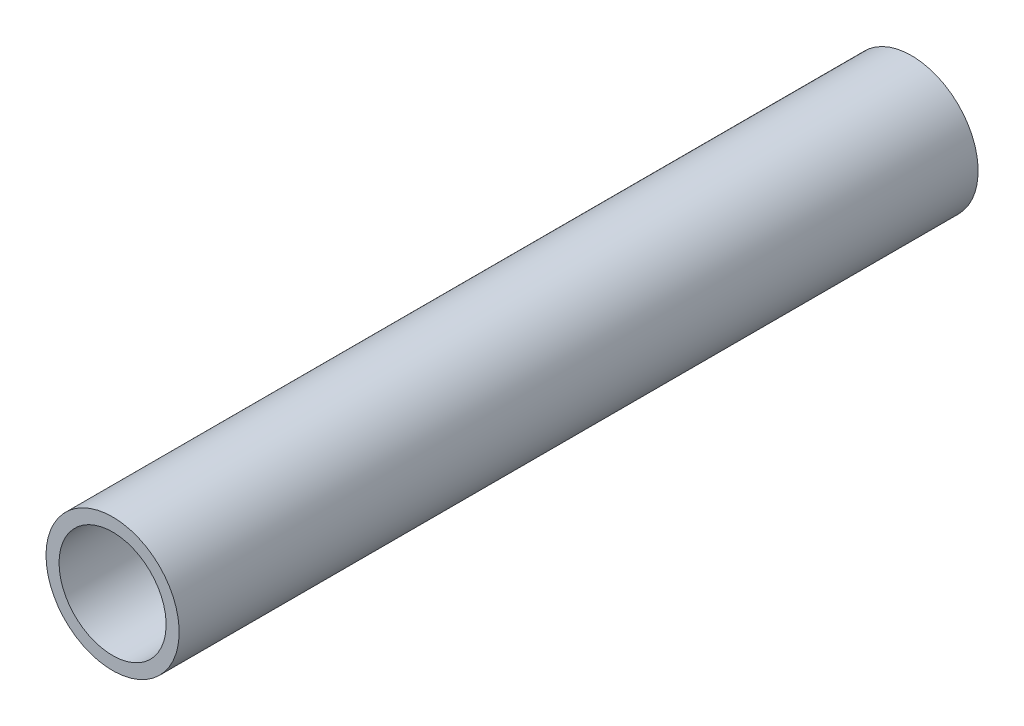
ISO-10303-21;
HEADER;
FILE_DESCRIPTION(('STEP AP214'),'2;1');
FILE_NAME('part.step','',(''),(''),'','','');
FILE_SCHEMA(('AUTOMOTIVE_DESIGN { 1 0 10303 214 1 1 1 1 }'));
ENDSEC;
DATA;
#1=APPLICATION_CONTEXT('core data for automotive mechanical design processes');
#2=APPLICATION_PROTOCOL_DEFINITION('international standard','automotive_design',2000,#1);
#3=PRODUCT_CONTEXT('',#1,'mechanical');
#4=PRODUCT('Part','Part','',(#3));
#5=PRODUCT_RELATED_PRODUCT_CATEGORY('part','',(#4));
#6=PRODUCT_DEFINITION_FORMATION('','',#4);
#7=PRODUCT_DEFINITION_CONTEXT('part definition',#1,'design');
#8=PRODUCT_DEFINITION('design','',#6,#7);
#9=PRODUCT_DEFINITION_SHAPE('','',#8);
#10=(LENGTH_UNIT() NAMED_UNIT(*) SI_UNIT(.MILLI.,.METRE.));
#11=(NAMED_UNIT(*) PLANE_ANGLE_UNIT() SI_UNIT($,.RADIAN.));
#12=(NAMED_UNIT(*) SI_UNIT($,.STERADIAN.) SOLID_ANGLE_UNIT());
#13=UNCERTAINTY_MEASURE_WITH_UNIT(LENGTH_MEASURE(1.E-05),#10,'distance_accuracy_value','');
#14=(GEOMETRIC_REPRESENTATION_CONTEXT(3) GLOBAL_UNCERTAINTY_ASSIGNED_CONTEXT((#13)) GLOBAL_UNIT_ASSIGNED_CONTEXT((#10,
#11,#12)) REPRESENTATION_CONTEXT('',''));
#15=CARTESIAN_POINT('',(0.,0.,0.));
#16=DIRECTION('',(0.,0.,1.));
#17=DIRECTION('',(1.,0.,0.));
#18=AXIS2_PLACEMENT_3D('',#15,#16,#17);
#19=CARTESIAN_POINT('',(0.,0.,-76.2));
#20=DIRECTION('',(0.,0.,-1.));
#21=DIRECTION('',(1.,0.,0.));
#22=AXIS2_PLACEMENT_3D('',#19,#20,#21);
#23=PLANE('',#22);
#24=CARTESIAN_POINT('',(0.,0.,-76.2));
#25=DIRECTION('',(0.,0.,1.));
#26=DIRECTION('',(1.,0.,0.));
#27=AXIS2_PLACEMENT_3D('',#24,#25,#26);
#28=CIRCLE('',#27,6.35);
#29=CARTESIAN_POINT('',(-6.35,0.,-76.2));
#30=VERTEX_POINT('',#29);
#31=EDGE_CURVE('E10',#30,#30,#28,.T.);
#32=ORIENTED_EDGE('',*,*,#31,.F.);
#33=EDGE_LOOP('',(#32));
#34=FACE_BOUND('',#33,.T.);
#35=CARTESIAN_POINT('',(0.,0.,-76.2));
#36=DIRECTION('',(0.,0.,1.));
#37=DIRECTION('',(1.,0.,0.));
#38=AXIS2_PLACEMENT_3D('',#35,#36,#37);
#39=CIRCLE('',#38,5.1054);
#40=CARTESIAN_POINT('',(-5.1054,0.,-76.2));
#41=VERTEX_POINT('',#40);
#42=EDGE_CURVE('E52',#41,#41,#39,.T.);
#43=ORIENTED_EDGE('',*,*,#42,.T.);
#44=EDGE_LOOP('',(#43));
#45=FACE_BOUND('',#44,.T.);
#46=ADVANCED_FACE('F41',(#34,#45),#23,.T.);
#47=CARTESIAN_POINT('',(0.,0.,0.));
#48=DIRECTION('',(0.,0.,-1.));
#49=DIRECTION('',(1.,0.,0.));
#50=AXIS2_PLACEMENT_3D('',#47,#48,#49);
#51=PLANE('',#50);
#52=CARTESIAN_POINT('',(0.,0.,0.));
#53=DIRECTION('',(0.,0.,1.));
#54=DIRECTION('',(1.,0.,0.));
#55=AXIS2_PLACEMENT_3D('',#52,#53,#54);
#56=CIRCLE('',#55,6.35);
#57=CARTESIAN_POINT('',(-6.35,0.,0.));
#58=VERTEX_POINT('',#57);
#59=EDGE_CURVE('E45',#58,#58,#56,.T.);
#60=ORIENTED_EDGE('',*,*,#59,.T.);
#61=EDGE_LOOP('',(#60));
#62=FACE_BOUND('',#61,.T.);
#63=CARTESIAN_POINT('',(0.,0.,0.));
#64=DIRECTION('',(0.,0.,1.));
#65=DIRECTION('',(1.,0.,0.));
#66=AXIS2_PLACEMENT_3D('',#63,#64,#65);
#67=CIRCLE('',#66,5.1054);
#68=CARTESIAN_POINT('',(-5.1054,0.,0.));
#69=VERTEX_POINT('',#68);
#70=EDGE_CURVE('E54',#69,#69,#67,.T.);
#71=ORIENTED_EDGE('',*,*,#70,.F.);
#72=EDGE_LOOP('',(#71));
#73=FACE_BOUND('',#72,.T.);
#74=ADVANCED_FACE('F67',(#62,#73),#51,.F.);
#75=CARTESIAN_POINT('',(0.,0.,-76.2));
#76=DIRECTION('',(0.,0.,1.));
#77=DIRECTION('',(-1.,0.,0.));
#78=AXIS2_PLACEMENT_3D('',#75,#76,#77);
#79=CYLINDRICAL_SURFACE('',#78,6.35);
#80=CARTESIAN_POINT('',(-6.35,0.,-76.2));
#81=CARTESIAN_POINT('',(-6.35,0.,-75.40625));
#82=CARTESIAN_POINT('',(-6.35,0.,-74.6125));
#83=CARTESIAN_POINT('',(-6.35,0.,-73.025));
#84=CARTESIAN_POINT('',(-6.35,0.,-72.23125));
#85=CARTESIAN_POINT('',(-6.35,0.,-70.64375));
#86=CARTESIAN_POINT('',(-6.35,0.,-69.85));
#87=CARTESIAN_POINT('',(-6.35,0.,-68.2625));
#88=CARTESIAN_POINT('',(-6.35,0.,-67.46875));
#89=CARTESIAN_POINT('',(-6.35,0.,-65.88125));
#90=CARTESIAN_POINT('',(-6.35,0.,-65.0875));
#91=CARTESIAN_POINT('',(-6.35,0.,-63.5));
#92=CARTESIAN_POINT('',(-6.35,0.,-62.70625));
#93=CARTESIAN_POINT('',(-6.35,0.,-61.11875));
#94=CARTESIAN_POINT('',(-6.35,0.,-60.325));
#95=CARTESIAN_POINT('',(-6.35,0.,-58.7375));
#96=CARTESIAN_POINT('',(-6.35,0.,-57.94375));
#97=CARTESIAN_POINT('',(-6.35,0.,-56.35625));
#98=CARTESIAN_POINT('',(-6.35,0.,-55.5625));
#99=CARTESIAN_POINT('',(-6.35,0.,-53.975));
#100=CARTESIAN_POINT('',(-6.35,0.,-53.18125));
#101=CARTESIAN_POINT('',(-6.35,0.,-51.59375));
#102=CARTESIAN_POINT('',(-6.35,0.,-50.8));
#103=CARTESIAN_POINT('',(-6.35,0.,-49.2125));
#104=CARTESIAN_POINT('',(-6.35,0.,-48.41875));
#105=CARTESIAN_POINT('',(-6.35,0.,-46.83125));
#106=CARTESIAN_POINT('',(-6.35,0.,-46.0375));
#107=CARTESIAN_POINT('',(-6.35,0.,-44.45));
#108=CARTESIAN_POINT('',(-6.35,0.,-43.65625));
#109=CARTESIAN_POINT('',(-6.35,0.,-42.06875));
#110=CARTESIAN_POINT('',(-6.35,0.,-41.275));
#111=CARTESIAN_POINT('',(-6.35,0.,-39.6875));
#112=CARTESIAN_POINT('',(-6.35,0.,-38.89375));
#113=CARTESIAN_POINT('',(-6.35,0.,-37.30625));
#114=CARTESIAN_POINT('',(-6.35,0.,-36.5125));
#115=CARTESIAN_POINT('',(-6.35,0.,-34.925));
#116=CARTESIAN_POINT('',(-6.35,0.,-34.13125));
#117=CARTESIAN_POINT('',(-6.35,0.,-32.54375));
#118=CARTESIAN_POINT('',(-6.35,0.,-31.75));
#119=CARTESIAN_POINT('',(-6.35,0.,-30.1625));
#120=CARTESIAN_POINT('',(-6.35,0.,-29.36875));
#121=CARTESIAN_POINT('',(-6.35,0.,-27.78125));
#122=CARTESIAN_POINT('',(-6.35,0.,-26.9875));
#123=CARTESIAN_POINT('',(-6.35,0.,-25.4));
#124=CARTESIAN_POINT('',(-6.35,0.,-24.60625));
#125=CARTESIAN_POINT('',(-6.35,0.,-23.01875));
#126=CARTESIAN_POINT('',(-6.35,0.,-22.225));
#127=CARTESIAN_POINT('',(-6.35,0.,-20.6375));
#128=CARTESIAN_POINT('',(-6.35,0.,-19.84375));
#129=CARTESIAN_POINT('',(-6.35,0.,-18.25625));
#130=CARTESIAN_POINT('',(-6.35,0.,-17.4625));
#131=CARTESIAN_POINT('',(-6.35,0.,-15.875));
#132=CARTESIAN_POINT('',(-6.35,0.,-15.08125));
#133=CARTESIAN_POINT('',(-6.35,0.,-13.49375));
#134=CARTESIAN_POINT('',(-6.35,0.,-12.7));
#135=CARTESIAN_POINT('',(-6.35,0.,-11.1125));
#136=CARTESIAN_POINT('',(-6.35,0.,-10.31875));
#137=CARTESIAN_POINT('',(-6.35,0.,-8.73125));
#138=CARTESIAN_POINT('',(-6.35,0.,-7.93750000000001));
#139=CARTESIAN_POINT('',(-6.35,0.,-6.35));
#140=CARTESIAN_POINT('',(-6.35,0.,-5.55625));
#141=CARTESIAN_POINT('',(-6.35,0.,-3.96875));
#142=CARTESIAN_POINT('',(-6.35,0.,-3.175));
#143=CARTESIAN_POINT('',(-6.35,0.,-1.5875));
#144=CARTESIAN_POINT('',(-6.35,0.,-0.793750000000001));
#145=CARTESIAN_POINT('',(-6.35,0.,0.));
#146=B_SPLINE_CURVE_WITH_KNOTS('',3,(#80,#81,#82,#83,#84,#85,#86,#87,#88,#89,#90,#91,#92,#93,
#94,#95,#96,#97,#98,#99,#100,#101,#102,#103,#104,#105,#106,#107,#108,#109,#110,#111,#112,#113,
#114,#115,#116,#117,#118,#119,#120,#121,#122,#123,#124,#125,#126,#127,#128,#129,#130,#131,#132,
#133,#134,#135,#136,#137,#138,#139,#140,#141,#142,#143,#144,#145),.UNSPECIFIED.,.F.,.F.,(4,2,2,
2,2,2,2,2,2,2,2,2,2,2,2,2,2,2,2,2,2,2,2,2,2,2,2,2,2,2,2,2,4),(0.,2.38125,4.7625,7.14375,
9.52500000000001,11.90625,14.2875,16.66875,19.05,21.43125,23.8125,26.19375,28.575,30.95625,
33.3375,35.71875,38.1,40.48125,42.8625,45.24375,47.625,50.00625,52.3875,54.76875,57.15,59.53125,
61.9125,64.29375,66.675,69.05625,71.4375,73.81875,76.2),.UNSPECIFIED.);
#147=EDGE_CURVE('BSEAM43',#30,#58,#146,.T.);
#148=ORIENTED_EDGE('',*,*,#31,.T.);
#149=ORIENTED_EDGE('',*,*,#59,.F.);
#150=ORIENTED_EDGE('',*,*,#147,.T.);
#151=ORIENTED_EDGE('',*,*,#147,.F.);
#152=EDGE_LOOP('',(#148,#150,#149,#151));
#153=FACE_BOUND('',#152,.T.);
#154=ADVANCED_FACE('F43',(#153),#79,.T.);
#155=CARTESIAN_POINT('',(0.,0.,-76.2));
#156=DIRECTION('',(0.,0.,1.));
#157=DIRECTION('',(-1.,0.,0.));
#158=AXIS2_PLACEMENT_3D('',#155,#156,#157);
#159=CYLINDRICAL_SURFACE('',#158,5.1054);
#160=CARTESIAN_POINT('',(-5.1054,0.,-76.2));
#161=CARTESIAN_POINT('',(-5.1054,0.,-75.40625));
#162=CARTESIAN_POINT('',(-5.1054,0.,-74.6125));
#163=CARTESIAN_POINT('',(-5.1054,0.,-73.025));
#164=CARTESIAN_POINT('',(-5.1054,0.,-72.23125));
#165=CARTESIAN_POINT('',(-5.1054,0.,-70.64375));
#166=CARTESIAN_POINT('',(-5.1054,0.,-69.85));
#167=CARTESIAN_POINT('',(-5.1054,0.,-68.2625));
#168=CARTESIAN_POINT('',(-5.1054,0.,-67.46875));
#169=CARTESIAN_POINT('',(-5.1054,0.,-65.88125));
#170=CARTESIAN_POINT('',(-5.1054,0.,-65.0875));
#171=CARTESIAN_POINT('',(-5.1054,0.,-63.5));
#172=CARTESIAN_POINT('',(-5.1054,0.,-62.70625));
#173=CARTESIAN_POINT('',(-5.1054,0.,-61.11875));
#174=CARTESIAN_POINT('',(-5.1054,0.,-60.325));
#175=CARTESIAN_POINT('',(-5.1054,0.,-58.7375));
#176=CARTESIAN_POINT('',(-5.1054,0.,-57.94375));
#177=CARTESIAN_POINT('',(-5.1054,0.,-56.35625));
#178=CARTESIAN_POINT('',(-5.1054,0.,-55.5625));
#179=CARTESIAN_POINT('',(-5.1054,0.,-53.975));
#180=CARTESIAN_POINT('',(-5.1054,0.,-53.18125));
#181=CARTESIAN_POINT('',(-5.1054,0.,-51.59375));
#182=CARTESIAN_POINT('',(-5.1054,0.,-50.8));
#183=CARTESIAN_POINT('',(-5.1054,0.,-49.2125));
#184=CARTESIAN_POINT('',(-5.1054,0.,-48.41875));
#185=CARTESIAN_POINT('',(-5.1054,0.,-46.83125));
#186=CARTESIAN_POINT('',(-5.1054,0.,-46.0375));
#187=CARTESIAN_POINT('',(-5.1054,0.,-44.45));
#188=CARTESIAN_POINT('',(-5.1054,0.,-43.65625));
#189=CARTESIAN_POINT('',(-5.1054,0.,-42.06875));
#190=CARTESIAN_POINT('',(-5.1054,0.,-41.275));
#191=CARTESIAN_POINT('',(-5.1054,0.,-39.6875));
#192=CARTESIAN_POINT('',(-5.1054,0.,-38.89375));
#193=CARTESIAN_POINT('',(-5.1054,0.,-37.30625));
#194=CARTESIAN_POINT('',(-5.1054,0.,-36.5125));
#195=CARTESIAN_POINT('',(-5.1054,0.,-34.925));
#196=CARTESIAN_POINT('',(-5.1054,0.,-34.13125));
#197=CARTESIAN_POINT('',(-5.1054,0.,-32.54375));
#198=CARTESIAN_POINT('',(-5.1054,0.,-31.75));
#199=CARTESIAN_POINT('',(-5.1054,0.,-30.1625));
#200=CARTESIAN_POINT('',(-5.1054,0.,-29.36875));
#201=CARTESIAN_POINT('',(-5.1054,0.,-27.78125));
#202=CARTESIAN_POINT('',(-5.1054,0.,-26.9875));
#203=CARTESIAN_POINT('',(-5.1054,0.,-25.4));
#204=CARTESIAN_POINT('',(-5.1054,0.,-24.60625));
#205=CARTESIAN_POINT('',(-5.1054,0.,-23.01875));
#206=CARTESIAN_POINT('',(-5.1054,0.,-22.225));
#207=CARTESIAN_POINT('',(-5.1054,0.,-20.6375));
#208=CARTESIAN_POINT('',(-5.1054,0.,-19.84375));
#209=CARTESIAN_POINT('',(-5.1054,0.,-18.25625));
#210=CARTESIAN_POINT('',(-5.1054,0.,-17.4625));
#211=CARTESIAN_POINT('',(-5.1054,0.,-15.875));
#212=CARTESIAN_POINT('',(-5.1054,0.,-15.08125));
#213=CARTESIAN_POINT('',(-5.1054,0.,-13.49375));
#214=CARTESIAN_POINT('',(-5.1054,0.,-12.7));
#215=CARTESIAN_POINT('',(-5.1054,0.,-11.1125));
#216=CARTESIAN_POINT('',(-5.1054,0.,-10.31875));
#217=CARTESIAN_POINT('',(-5.1054,0.,-8.73125));
#218=CARTESIAN_POINT('',(-5.1054,0.,-7.93750000000001));
#219=CARTESIAN_POINT('',(-5.1054,0.,-6.35));
#220=CARTESIAN_POINT('',(-5.1054,0.,-5.55625));
#221=CARTESIAN_POINT('',(-5.1054,0.,-3.96875));
#222=CARTESIAN_POINT('',(-5.1054,0.,-3.175));
#223=CARTESIAN_POINT('',(-5.1054,0.,-1.5875));
#224=CARTESIAN_POINT('',(-5.1054,0.,-0.793750000000001));
#225=CARTESIAN_POINT('',(-5.1054,0.,0.));
#226=B_SPLINE_CURVE_WITH_KNOTS('',3,(#160,#161,#162,#163,#164,#165,#166,#167,#168,#169,#170,
#171,#172,#173,#174,#175,#176,#177,#178,#179,#180,#181,#182,#183,#184,#185,#186,#187,#188,#189,
#190,#191,#192,#193,#194,#195,#196,#197,#198,#199,#200,#201,#202,#203,#204,#205,#206,#207,#208,
#209,#210,#211,#212,#213,#214,#215,#216,#217,#218,#219,#220,#221,#222,#223,#224,#225),
.UNSPECIFIED.,.F.,.F.,(4,2,2,2,2,2,2,2,2,2,2,2,2,2,2,2,2,2,2,2,2,2,2,2,2,2,2,2,2,2,2,2,4),(0.,
2.38125,4.7625,7.14375,9.52500000000001,11.90625,14.2875,16.66875,19.05,21.43125,23.8125,
26.19375,28.575,30.95625,33.3375,35.71875,38.1,40.48125,42.8625,45.24375,47.625,50.00625,
52.3875,54.76875,57.15,59.53125,61.9125,64.29375,66.675,69.05625,71.4375,73.81875,76.2),.UNSPECIFIED.);
#227=EDGE_CURVE('BSEAM61',#41,#69,#226,.T.);
#228=ORIENTED_EDGE('',*,*,#42,.F.);
#229=ORIENTED_EDGE('',*,*,#70,.T.);
#230=ORIENTED_EDGE('',*,*,#227,.T.);
#231=ORIENTED_EDGE('',*,*,#227,.F.);
#232=EDGE_LOOP('',(#228,#230,#229,#231));
#233=FACE_BOUND('',#232,.T.);
#234=ADVANCED_FACE('F61',(#233),#159,.F.);
#235=CLOSED_SHELL('',(#46,#74,#154,#234));
#236=MANIFOLD_SOLID_BREP('B2',#235);
#237=ADVANCED_BREP_SHAPE_REPRESENTATION('',(#18,#236),#14);
#238=SHAPE_DEFINITION_REPRESENTATION(#9,#237);
ENDSEC;
END-ISO-10303-21;
